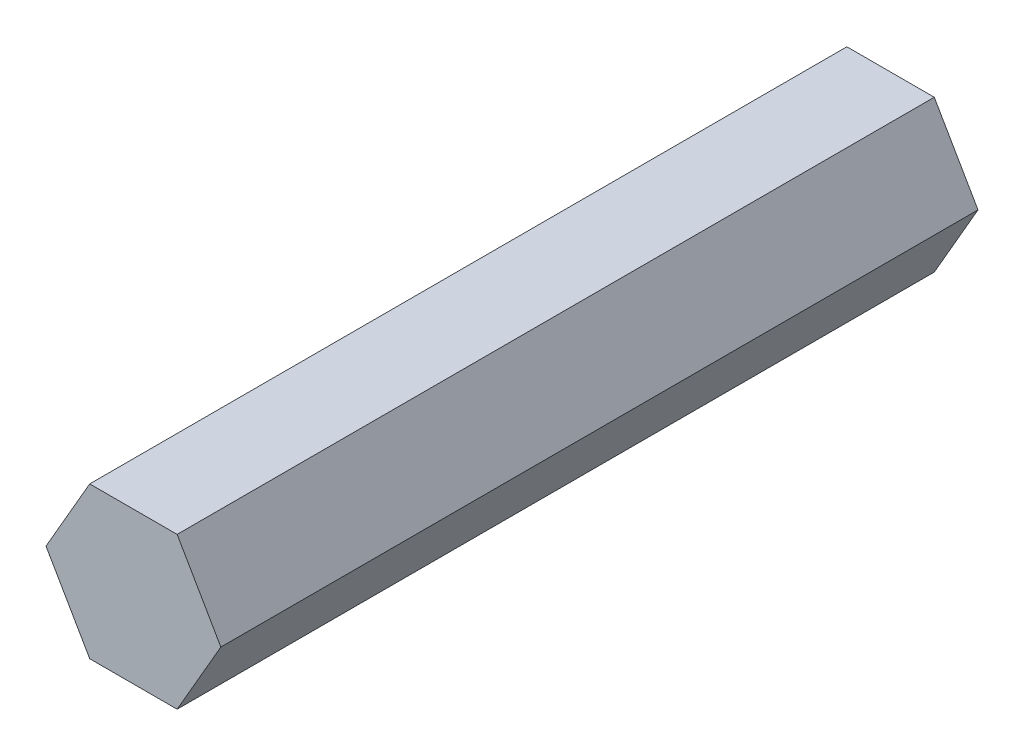
ISO-10303-21;
HEADER;
FILE_DESCRIPTION(('STEP AP214'),'2;1');
FILE_NAME('part.step','',(''),(''),'','','');
FILE_SCHEMA(('AUTOMOTIVE_DESIGN { 1 0 10303 214 1 1 1 1 }'));
ENDSEC;
DATA;
#1=APPLICATION_CONTEXT('core data for automotive mechanical design processes');
#2=APPLICATION_PROTOCOL_DEFINITION('international standard','automotive_design',2000,#1);
#3=PRODUCT_CONTEXT('',#1,'mechanical');
#4=PRODUCT('Part','Part','',(#3));
#5=PRODUCT_RELATED_PRODUCT_CATEGORY('part','',(#4));
#6=PRODUCT_DEFINITION_FORMATION('','',#4);
#7=PRODUCT_DEFINITION_CONTEXT('part definition',#1,'design');
#8=PRODUCT_DEFINITION('design','',#6,#7);
#9=PRODUCT_DEFINITION_SHAPE('','',#8);
#10=(LENGTH_UNIT() NAMED_UNIT(*) SI_UNIT(.MILLI.,.METRE.));
#11=(NAMED_UNIT(*) PLANE_ANGLE_UNIT() SI_UNIT($,.RADIAN.));
#12=(NAMED_UNIT(*) SI_UNIT($,.STERADIAN.) SOLID_ANGLE_UNIT());
#13=UNCERTAINTY_MEASURE_WITH_UNIT(LENGTH_MEASURE(1.E-05),#10,'distance_accuracy_value','');
#14=(GEOMETRIC_REPRESENTATION_CONTEXT(3) GLOBAL_UNCERTAINTY_ASSIGNED_CONTEXT((#13)) GLOBAL_UNIT_ASSIGNED_CONTEXT((#10,
#11,#12)) REPRESENTATION_CONTEXT('',''));
#15=CARTESIAN_POINT('',(0.,0.,0.));
#16=DIRECTION('',(0.,0.,1.));
#17=DIRECTION('',(1.,0.,0.));
#18=AXIS2_PLACEMENT_3D('',#15,#16,#17);
#19=CARTESIAN_POINT('',(3.66617420935413,-6.35,63.5));
#20=DIRECTION('',(-0.866025403784439,0.5,0.));
#21=DIRECTION('',(-0.5,-0.866025403784439,0.));
#22=AXIS2_PLACEMENT_3D('',#19,#20,#21);
#23=PLANE('',#22);
#24=DIRECTION('',(0.5,0.866025403784439,0.));
#25=VECTOR('',#24,1.);
#26=CARTESIAN_POINT('',(3.66617420935413,-6.35,0.));
#27=LINE('',#26,#25);
#28=CARTESIAN_POINT('',(3.66617420935413,-6.35,0.));
#29=VERTEX_POINT('',#28);
#30=CARTESIAN_POINT('',(7.33234841870825,0.,0.));
#31=VERTEX_POINT('',#30);
#32=EDGE_CURVE('E134',#29,#31,#27,.T.);
#33=ORIENTED_EDGE('',*,*,#32,.T.);
#34=DIRECTION('',(0.,0.,-1.));
#35=VECTOR('',#34,1.);
#36=CARTESIAN_POINT('',(7.33234841870825,0.,63.5));
#37=LINE('',#36,#35);
#38=CARTESIAN_POINT('',(7.33234841870825,0.,63.5));
#39=VERTEX_POINT('',#38);
#40=EDGE_CURVE('E11',#39,#31,#37,.T.);
#41=ORIENTED_EDGE('',*,*,#40,.F.);
#42=DIRECTION('',(0.5,0.866025403784439,0.));
#43=VECTOR('',#42,1.);
#44=CARTESIAN_POINT('',(3.66617420935413,-6.35,63.5));
#45=LINE('',#44,#43);
#46=CARTESIAN_POINT('',(3.66617420935413,-6.35,63.5));
#47=VERTEX_POINT('',#46);
#48=EDGE_CURVE('E150',#47,#39,#45,.T.);
#49=ORIENTED_EDGE('',*,*,#48,.F.);
#50=DIRECTION('',(0.,0.,-1.));
#51=VECTOR('',#50,1.);
#52=CARTESIAN_POINT('',(3.66617420935413,-6.35,63.5));
#53=LINE('',#52,#51);
#54=EDGE_CURVE('E130',#47,#29,#53,.T.);
#55=ORIENTED_EDGE('',*,*,#54,.T.);
#56=EDGE_LOOP('',(#33,#41,#49,#55));
#57=FACE_BOUND('',#56,.T.);
#58=ADVANCED_FACE('F45',(#57),#23,.F.);
#59=CARTESIAN_POINT('',(7.33234841870825,0.,63.5));
#60=DIRECTION('',(-0.866025403784438,-0.5,0.));
#61=DIRECTION('',(0.5,-0.866025403784439,0.));
#62=AXIS2_PLACEMENT_3D('',#59,#60,#61);
#63=PLANE('',#62);
#64=DIRECTION('',(-0.5,0.866025403784438,0.));
#65=VECTOR('',#64,1.);
#66=CARTESIAN_POINT('',(7.33234841870825,0.,0.));
#67=LINE('',#66,#65);
#68=CARTESIAN_POINT('',(3.66617420935412,6.35,0.));
#69=VERTEX_POINT('',#68);
#70=EDGE_CURVE('E138',#31,#69,#67,.T.);
#71=ORIENTED_EDGE('',*,*,#70,.T.);
#72=DIRECTION('',(0.,0.,-1.));
#73=VECTOR('',#72,1.);
#74=CARTESIAN_POINT('',(3.66617420935412,6.35,63.5));
#75=LINE('',#74,#73);
#76=CARTESIAN_POINT('',(3.66617420935412,6.35,63.5));
#77=VERTEX_POINT('',#76);
#78=EDGE_CURVE('E54',#77,#69,#75,.T.);
#79=ORIENTED_EDGE('',*,*,#78,.F.);
#80=DIRECTION('',(-0.5,0.866025403784438,0.));
#81=VECTOR('',#80,1.);
#82=CARTESIAN_POINT('',(7.33234841870825,0.,63.5));
#83=LINE('',#82,#81);
#84=EDGE_CURVE('E99',#39,#77,#83,.T.);
#85=ORIENTED_EDGE('',*,*,#84,.F.);
#86=ORIENTED_EDGE('',*,*,#40,.T.);
#87=EDGE_LOOP('',(#71,#79,#85,#86));
#88=FACE_BOUND('',#87,.T.);
#89=ADVANCED_FACE('F178',(#88),#63,.F.);
#90=CARTESIAN_POINT('',(3.66617420935412,6.35,63.5));
#91=DIRECTION('',(0.,-1.,0.));
#92=DIRECTION('',(0.,0.,-1.));
#93=AXIS2_PLACEMENT_3D('',#90,#91,#92);
#94=PLANE('',#93);
#95=DIRECTION('',(-1.,0.,0.));
#96=VECTOR('',#95,1.);
#97=CARTESIAN_POINT('',(3.66617420935412,6.35,0.));
#98=LINE('',#97,#96);
#99=CARTESIAN_POINT('',(-3.66617420935412,6.35,0.));
#100=VERTEX_POINT('',#99);
#101=EDGE_CURVE('E141',#69,#100,#98,.T.);
#102=ORIENTED_EDGE('',*,*,#101,.T.);
#103=DIRECTION('',(0.,0.,-1.));
#104=VECTOR('',#103,1.);
#105=CARTESIAN_POINT('',(-3.66617420935412,6.35,63.5));
#106=LINE('',#105,#104);
#107=CARTESIAN_POINT('',(-3.66617420935412,6.35,63.5));
#108=VERTEX_POINT('',#107);
#109=EDGE_CURVE('E123',#108,#100,#106,.T.);
#110=ORIENTED_EDGE('',*,*,#109,.F.);
#111=DIRECTION('',(-1.,0.,0.));
#112=VECTOR('',#111,1.);
#113=CARTESIAN_POINT('',(3.66617420935412,6.35,63.5));
#114=LINE('',#113,#112);
#115=EDGE_CURVE('E112',#77,#108,#114,.T.);
#116=ORIENTED_EDGE('',*,*,#115,.F.);
#117=ORIENTED_EDGE('',*,*,#78,.T.);
#118=EDGE_LOOP('',(#102,#110,#116,#117));
#119=FACE_BOUND('',#118,.T.);
#120=ADVANCED_FACE('F160',(#119),#94,.F.);
#121=CARTESIAN_POINT('',(-3.66617420935412,6.35,63.5));
#122=DIRECTION('',(0.866025403784438,-0.5,0.));
#123=DIRECTION('',(0.5,0.866025403784439,0.));
#124=AXIS2_PLACEMENT_3D('',#121,#122,#123);
#125=PLANE('',#124);
#126=DIRECTION('',(-0.5,-0.866025403784438,0.));
#127=VECTOR('',#126,1.);
#128=CARTESIAN_POINT('',(-3.66617420935412,6.35,0.));
#129=LINE('',#128,#127);
#130=CARTESIAN_POINT('',(-7.33234841870825,0.,0.));
#131=VERTEX_POINT('',#130);
#132=EDGE_CURVE('E121',#100,#131,#129,.T.);
#133=ORIENTED_EDGE('',*,*,#132,.T.);
#134=DIRECTION('',(0.,0.,-1.));
#135=VECTOR('',#134,1.);
#136=CARTESIAN_POINT('',(-7.33234841870825,0.,63.5));
#137=LINE('',#136,#135);
#138=CARTESIAN_POINT('',(-7.33234841870825,0.,63.5));
#139=VERTEX_POINT('',#138);
#140=EDGE_CURVE('E118',#139,#131,#137,.T.);
#141=ORIENTED_EDGE('',*,*,#140,.F.);
#142=DIRECTION('',(-0.5,-0.866025403784438,0.));
#143=VECTOR('',#142,1.);
#144=CARTESIAN_POINT('',(-3.66617420935412,6.35,63.5));
#145=LINE('',#144,#143);
#146=EDGE_CURVE('E106',#108,#139,#145,.T.);
#147=ORIENTED_EDGE('',*,*,#146,.F.);
#148=ORIENTED_EDGE('',*,*,#109,.T.);
#149=EDGE_LOOP('',(#133,#141,#147,#148));
#150=FACE_BOUND('',#149,.T.);
#151=ADVANCED_FACE('F119',(#150),#125,.F.);
#152=CARTESIAN_POINT('',(-7.33234841870825,0.,63.5));
#153=DIRECTION('',(0.866025403784438,0.5,0.));
#154=DIRECTION('',(-0.5,0.866025403784438,0.));
#155=AXIS2_PLACEMENT_3D('',#152,#153,#154);
#156=PLANE('',#155);
#157=DIRECTION('',(0.5,-0.866025403784438,0.));
#158=VECTOR('',#157,1.);
#159=CARTESIAN_POINT('',(-7.33234841870825,0.,0.));
#160=LINE('',#159,#158);
#161=CARTESIAN_POINT('',(-3.66617420935412,-6.35,0.));
#162=VERTEX_POINT('',#161);
#163=EDGE_CURVE('E85',#131,#162,#160,.T.);
#164=ORIENTED_EDGE('',*,*,#163,.T.);
#165=DIRECTION('',(0.,0.,-1.));
#166=VECTOR('',#165,1.);
#167=CARTESIAN_POINT('',(-3.66617420935412,-6.35,63.5));
#168=LINE('',#167,#166);
#169=CARTESIAN_POINT('',(-3.66617420935412,-6.35,63.5));
#170=VERTEX_POINT('',#169);
#171=EDGE_CURVE('E124',#170,#162,#168,.T.);
#172=ORIENTED_EDGE('',*,*,#171,.F.);
#173=DIRECTION('',(0.5,-0.866025403784438,0.));
#174=VECTOR('',#173,1.);
#175=CARTESIAN_POINT('',(-7.33234841870825,0.,63.5));
#176=LINE('',#175,#174);
#177=EDGE_CURVE('E110',#139,#170,#176,.T.);
#178=ORIENTED_EDGE('',*,*,#177,.F.);
#179=ORIENTED_EDGE('',*,*,#140,.T.);
#180=EDGE_LOOP('',(#164,#172,#178,#179));
#181=FACE_BOUND('',#180,.T.);
#182=ADVANCED_FACE('F126',(#181),#156,.F.);
#183=CARTESIAN_POINT('',(-3.66617420935412,-6.35,63.5));
#184=DIRECTION('',(0.,1.,0.));
#185=DIRECTION('',(-1.,0.,0.));
#186=AXIS2_PLACEMENT_3D('',#183,#184,#185);
#187=PLANE('',#186);
#188=DIRECTION('',(1.,0.,0.));
#189=VECTOR('',#188,1.);
#190=CARTESIAN_POINT('',(-3.66617420935412,-6.35,0.));
#191=LINE('',#190,#189);
#192=EDGE_CURVE('E91',#162,#29,#191,.T.);
#193=ORIENTED_EDGE('',*,*,#192,.T.);
#194=ORIENTED_EDGE('',*,*,#54,.F.);
#195=DIRECTION('',(1.,0.,0.));
#196=VECTOR('',#195,1.);
#197=CARTESIAN_POINT('',(-3.66617420935412,-6.35,63.5));
#198=LINE('',#197,#196);
#199=EDGE_CURVE('E62',#170,#47,#198,.T.);
#200=ORIENTED_EDGE('',*,*,#199,.F.);
#201=ORIENTED_EDGE('',*,*,#171,.T.);
#202=EDGE_LOOP('',(#193,#194,#200,#201));
#203=FACE_BOUND('',#202,.T.);
#204=ADVANCED_FACE('F167',(#203),#187,.F.);
#205=CARTESIAN_POINT('',(0.,0.,63.5));
#206=DIRECTION('',(0.,0.,1.));
#207=DIRECTION('',(1.,0.,0.));
#208=AXIS2_PLACEMENT_3D('',#205,#206,#207);
#209=PLANE('',#208);
#210=ORIENTED_EDGE('',*,*,#48,.T.);
#211=ORIENTED_EDGE('',*,*,#84,.T.);
#212=ORIENTED_EDGE('',*,*,#115,.T.);
#213=ORIENTED_EDGE('',*,*,#146,.T.);
#214=ORIENTED_EDGE('',*,*,#177,.T.);
#215=ORIENTED_EDGE('',*,*,#199,.T.);
#216=EDGE_LOOP('',(#210,#211,#212,#213,#214,#215));
#217=FACE_BOUND('',#216,.T.);
#218=ADVANCED_FACE('F108',(#217),#209,.T.);
#219=CARTESIAN_POINT('',(0.,0.,0.));
#220=DIRECTION('',(0.,0.,1.));
#221=DIRECTION('',(1.,0.,0.));
#222=AXIS2_PLACEMENT_3D('',#219,#220,#221);
#223=PLANE('',#222);
#224=ORIENTED_EDGE('',*,*,#32,.F.);
#225=ORIENTED_EDGE('',*,*,#192,.F.);
#226=ORIENTED_EDGE('',*,*,#163,.F.);
#227=ORIENTED_EDGE('',*,*,#132,.F.);
#228=ORIENTED_EDGE('',*,*,#101,.F.);
#229=ORIENTED_EDGE('',*,*,#70,.F.);
#230=EDGE_LOOP('',(#224,#225,#226,#227,#228,#229));
#231=FACE_BOUND('',#230,.T.);
#232=ADVANCED_FACE('F163',(#231),#223,.F.);
#233=CLOSED_SHELL('',(#58,#89,#120,#151,#182,#204,#218,#232));
#234=MANIFOLD_SOLID_BREP('B2',#233);
#235=ADVANCED_BREP_SHAPE_REPRESENTATION('',(#18,#234),#14);
#236=SHAPE_DEFINITION_REPRESENTATION(#9,#235);
ENDSEC;
END-ISO-10303-21;
